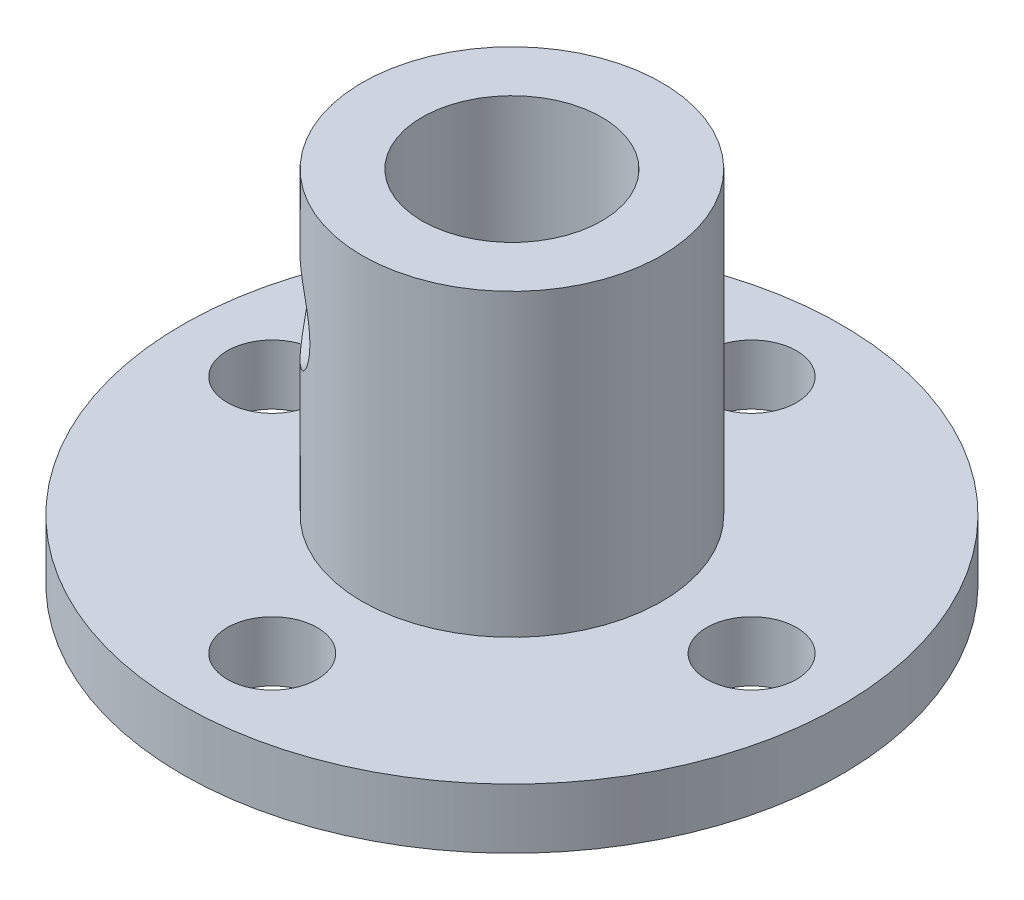
ISO-10303-21;
HEADER;
FILE_DESCRIPTION(('STEP AP214'),'2;1');
FILE_NAME('part.step','',(''),(''),'','','');
FILE_SCHEMA(('AUTOMOTIVE_DESIGN { 1 0 10303 214 1 1 1 1 }'));
ENDSEC;
DATA;
#1=APPLICATION_CONTEXT('core data for automotive mechanical design processes');
#2=APPLICATION_PROTOCOL_DEFINITION('international standard','automotive_design',2000,#1);
#3=PRODUCT_CONTEXT('',#1,'mechanical');
#4=PRODUCT('Part','Part','',(#3));
#5=PRODUCT_RELATED_PRODUCT_CATEGORY('part','',(#4));
#6=PRODUCT_DEFINITION_FORMATION('','',#4);
#7=PRODUCT_DEFINITION_CONTEXT('part definition',#1,'design');
#8=PRODUCT_DEFINITION('design','',#6,#7);
#9=PRODUCT_DEFINITION_SHAPE('','',#8);
#10=(LENGTH_UNIT() NAMED_UNIT(*) SI_UNIT(.MILLI.,.METRE.));
#11=(NAMED_UNIT(*) PLANE_ANGLE_UNIT() SI_UNIT($,.RADIAN.));
#12=(NAMED_UNIT(*) SI_UNIT($,.STERADIAN.) SOLID_ANGLE_UNIT());
#13=UNCERTAINTY_MEASURE_WITH_UNIT(LENGTH_MEASURE(1.E-05),#10,'distance_accuracy_value','');
#14=(GEOMETRIC_REPRESENTATION_CONTEXT(3) GLOBAL_UNCERTAINTY_ASSIGNED_CONTEXT((#13)) GLOBAL_UNIT_ASSIGNED_CONTEXT((#10,
#11,#12)) REPRESENTATION_CONTEXT('',''));
#15=CARTESIAN_POINT('',(0.,0.,0.));
#16=DIRECTION('',(0.,0.,1.));
#17=DIRECTION('',(1.,0.,0.));
#18=AXIS2_PLACEMENT_3D('',#15,#16,#17);
#19=CARTESIAN_POINT('',(0.,2.,0.));
#20=DIRECTION('',(0.,-1.,0.));
#21=DIRECTION('',(0.,0.,-1.));
#22=AXIS2_PLACEMENT_3D('',#19,#20,#21);
#23=CYLINDRICAL_SURFACE('',#22,11.);
#24=CARTESIAN_POINT('',(0.,2.,0.));
#25=DIRECTION('',(0.,1.,0.));
#26=DIRECTION('',(0.,0.,1.));
#27=AXIS2_PLACEMENT_3D('',#24,#25,#26);
#28=CIRCLE('',#27,11.);
#29=CARTESIAN_POINT('',(0.,2.,11.));
#30=VERTEX_POINT('',#29);
#31=EDGE_CURVE('E55',#30,#30,#28,.T.);
#32=ORIENTED_EDGE('',*,*,#31,.F.);
#33=EDGE_LOOP('',(#32));
#34=FACE_BOUND('',#33,.T.);
#35=CARTESIAN_POINT('',(0.,0.,0.));
#36=DIRECTION('',(0.,1.,0.));
#37=DIRECTION('',(0.,0.,1.));
#38=AXIS2_PLACEMENT_3D('',#35,#36,#37);
#39=CIRCLE('',#38,11.);
#40=CARTESIAN_POINT('',(0.,0.,11.));
#41=VERTEX_POINT('',#40);
#42=EDGE_CURVE('E60',#41,#41,#39,.T.);
#43=ORIENTED_EDGE('',*,*,#42,.T.);
#44=EDGE_LOOP('',(#43));
#45=FACE_BOUND('',#44,.T.);
#46=ADVANCED_FACE('F43',(#34,#45),#23,.T.);
#47=CARTESIAN_POINT('',(0.,2.,0.));
#48=DIRECTION('',(0.,1.,0.));
#49=DIRECTION('',(0.,0.,1.));
#50=AXIS2_PLACEMENT_3D('',#47,#48,#49);
#51=PLANE('',#50);
#52=CARTESIAN_POINT('',(0.,2.,8.));
#53=DIRECTION('',(0.,1.,0.));
#54=DIRECTION('',(0.,0.,1.));
#55=AXIS2_PLACEMENT_3D('',#52,#53,#54);
#56=CIRCLE('',#55,1.5);
#57=CARTESIAN_POINT('',(0.,2.,9.5));
#58=VERTEX_POINT('',#57);
#59=EDGE_CURVE('E77',#58,#58,#56,.T.);
#60=ORIENTED_EDGE('',*,*,#59,.F.);
#61=EDGE_LOOP('',(#60));
#62=FACE_BOUND('',#61,.T.);
#63=CARTESIAN_POINT('',(0.,2.,-8.));
#64=DIRECTION('',(0.,1.,0.));
#65=DIRECTION('',(0.,0.,1.));
#66=AXIS2_PLACEMENT_3D('',#63,#64,#65);
#67=CIRCLE('',#66,1.5);
#68=CARTESIAN_POINT('',(0.,2.,-6.5));
#69=VERTEX_POINT('',#68);
#70=EDGE_CURVE('E82',#69,#69,#67,.T.);
#71=ORIENTED_EDGE('',*,*,#70,.F.);
#72=EDGE_LOOP('',(#71));
#73=FACE_BOUND('',#72,.T.);
#74=CARTESIAN_POINT('',(8.,2.,0.));
#75=DIRECTION('',(0.,1.,0.));
#76=DIRECTION('',(0.,0.,1.));
#77=AXIS2_PLACEMENT_3D('',#74,#75,#76);
#78=CIRCLE('',#77,1.5);
#79=CARTESIAN_POINT('',(8.,2.,1.5));
#80=VERTEX_POINT('',#79);
#81=EDGE_CURVE('E85',#80,#80,#78,.T.);
#82=ORIENTED_EDGE('',*,*,#81,.F.);
#83=EDGE_LOOP('',(#82));
#84=FACE_BOUND('',#83,.T.);
#85=CARTESIAN_POINT('',(-8.,2.,0.));
#86=DIRECTION('',(0.,1.,0.));
#87=DIRECTION('',(0.,0.,1.));
#88=AXIS2_PLACEMENT_3D('',#85,#86,#87);
#89=CIRCLE('',#88,1.5);
#90=CARTESIAN_POINT('',(-8.,2.,1.5));
#91=VERTEX_POINT('',#90);
#92=EDGE_CURVE('E88',#91,#91,#89,.T.);
#93=ORIENTED_EDGE('',*,*,#92,.F.);
#94=EDGE_LOOP('',(#93));
#95=FACE_BOUND('',#94,.T.);
#96=CARTESIAN_POINT('',(0.,2.,0.));
#97=DIRECTION('',(0.,1.,0.));
#98=DIRECTION('',(0.,0.,1.));
#99=AXIS2_PLACEMENT_3D('',#96,#97,#98);
#100=CIRCLE('',#99,5.);
#101=CARTESIAN_POINT('',(0.,2.,5.));
#102=VERTEX_POINT('',#101);
#103=EDGE_CURVE('E10',#102,#102,#100,.T.);
#104=ORIENTED_EDGE('',*,*,#103,.F.);
#105=EDGE_LOOP('',(#104));
#106=FACE_BOUND('',#105,.T.);
#107=ORIENTED_EDGE('',*,*,#31,.T.);
#108=EDGE_LOOP('',(#107));
#109=FACE_BOUND('',#108,.T.);
#110=ADVANCED_FACE('F149',(#62,#73,#84,#95,#106,#109),#51,.T.);
#111=CARTESIAN_POINT('',(0.,0.,0.));
#112=DIRECTION('',(0.,1.,0.));
#113=DIRECTION('',(0.,0.,1.));
#114=AXIS2_PLACEMENT_3D('',#111,#112,#113);
#115=PLANE('',#114);
#116=CARTESIAN_POINT('',(0.,0.,8.));
#117=DIRECTION('',(0.,-1.,0.));
#118=DIRECTION('',(0.,0.,-1.));
#119=AXIS2_PLACEMENT_3D('',#116,#117,#118);
#120=CIRCLE('',#119,1.5);
#121=CARTESIAN_POINT('',(0.,0.,6.5));
#122=VERTEX_POINT('',#121);
#123=EDGE_CURVE('E91',#122,#122,#120,.T.);
#124=ORIENTED_EDGE('',*,*,#123,.F.);
#125=EDGE_LOOP('',(#124));
#126=FACE_BOUND('',#125,.T.);
#127=CARTESIAN_POINT('',(0.,0.,-8.));
#128=DIRECTION('',(0.,-1.,0.));
#129=DIRECTION('',(0.,0.,-1.));
#130=AXIS2_PLACEMENT_3D('',#127,#128,#129);
#131=CIRCLE('',#130,1.5);
#132=CARTESIAN_POINT('',(0.,0.,-9.5));
#133=VERTEX_POINT('',#132);
#134=EDGE_CURVE('E99',#133,#133,#131,.T.);
#135=ORIENTED_EDGE('',*,*,#134,.F.);
#136=EDGE_LOOP('',(#135));
#137=FACE_BOUND('',#136,.T.);
#138=CARTESIAN_POINT('',(8.,0.,0.));
#139=DIRECTION('',(0.,-1.,0.));
#140=DIRECTION('',(0.,0.,-1.));
#141=AXIS2_PLACEMENT_3D('',#138,#139,#140);
#142=CIRCLE('',#141,1.5);
#143=CARTESIAN_POINT('',(8.,0.,-1.5));
#144=VERTEX_POINT('',#143);
#145=EDGE_CURVE('E95',#144,#144,#142,.T.);
#146=ORIENTED_EDGE('',*,*,#145,.F.);
#147=EDGE_LOOP('',(#146));
#148=FACE_BOUND('',#147,.T.);
#149=CARTESIAN_POINT('',(-8.,0.,0.));
#150=DIRECTION('',(0.,-1.,0.));
#151=DIRECTION('',(0.,0.,-1.));
#152=AXIS2_PLACEMENT_3D('',#149,#150,#151);
#153=CIRCLE('',#152,1.5);
#154=CARTESIAN_POINT('',(-8.,0.,-1.5));
#155=VERTEX_POINT('',#154);
#156=EDGE_CURVE('E92',#155,#155,#153,.T.);
#157=ORIENTED_EDGE('',*,*,#156,.F.);
#158=EDGE_LOOP('',(#157));
#159=FACE_BOUND('',#158,.T.);
#160=CARTESIAN_POINT('',(0.,0.,0.));
#161=DIRECTION('',(0.,1.,0.));
#162=DIRECTION('',(0.,0.,1.));
#163=AXIS2_PLACEMENT_3D('',#160,#161,#162);
#164=CIRCLE('',#163,3.);
#165=CARTESIAN_POINT('',(0.,0.,3.));
#166=VERTEX_POINT('',#165);
#167=EDGE_CURVE('E69',#166,#166,#164,.T.);
#168=ORIENTED_EDGE('',*,*,#167,.T.);
#169=EDGE_LOOP('',(#168));
#170=FACE_BOUND('',#169,.T.);
#171=ORIENTED_EDGE('',*,*,#42,.F.);
#172=EDGE_LOOP('',(#171));
#173=FACE_BOUND('',#172,.T.);
#174=ADVANCED_FACE('F146',(#126,#137,#148,#159,#170,#173),#115,.F.);
#175=CARTESIAN_POINT('',(0.,12.,0.));
#176=DIRECTION('',(0.,-1.,0.));
#177=DIRECTION('',(0.,0.,-1.));
#178=AXIS2_PLACEMENT_3D('',#175,#176,#177);
#179=CYLINDRICAL_SURFACE('',#178,5.);
#180=CARTESIAN_POINT('',(-4.43334456258783,8.,2.31202421902819));
#181=CARTESIAN_POINT('',(-4.43334443992086,8.0821945479424,2.31202554403841));
#182=CARTESIAN_POINT('',(-4.43006993459257,8.16439922414403,2.31833642927143));
#183=CARTESIAN_POINT('',(-4.41695964010883,8.32640524959194,2.34321564064259));
#184=CARTESIAN_POINT('',(-4.40712165863545,8.40620578650146,2.36178806233067));
#185=CARTESIAN_POINT('',(-4.38087197181142,8.56103472827173,2.4101264355274));
#186=CARTESIAN_POINT('',(-4.36447119812474,8.63607082963309,2.43987376793349));
#187=CARTESIAN_POINT('',(-4.32504234678051,8.7796219339953,2.50910131305914));
#188=CARTESIAN_POINT('',(-4.3020132769563,8.84813595868444,2.54858298275095));
#189=CARTESIAN_POINT('',(-4.24852110256373,8.97886639057737,2.63681609316769));
#190=CARTESIAN_POINT('',(-4.21786377501926,9.04084589794629,2.68580086658526));
#191=CARTESIAN_POINT('',(-4.14950401628167,9.15463795132251,2.79025211380835));
#192=CARTESIAN_POINT('',(-4.11180068071223,9.20644919044988,2.84571941932361));
#193=CARTESIAN_POINT('',(-4.02870099338256,9.29946269983331,2.96222637051405));
#194=CARTESIAN_POINT('',(-3.98316167701534,9.34042342444281,3.02335752947632));
#195=CARTESIAN_POINT('',(-3.88552984554572,9.40898725904276,3.14784119759633));
#196=CARTESIAN_POINT('',(-3.83343874682247,9.43659324985745,3.21119322451312));
#197=CARTESIAN_POINT('',(-3.72532158709197,9.47688000109051,3.33595486065664));
#198=CARTESIAN_POINT('',(-3.66945071855995,9.4899651276527,3.39736819287556));
#199=CARTESIAN_POINT('',(-3.55395675199785,9.50211732464644,3.51800486407131));
#200=CARTESIAN_POINT('',(-3.49433444469874,9.50118733940196,3.57722866040972));
#201=CARTESIAN_POINT('',(-3.37510897121293,9.48560713145698,3.68987211946994));
#202=CARTESIAN_POINT('',(-3.31556566784942,9.47139480619013,3.74341656065754));
#203=CARTESIAN_POINT('',(-3.1965653052412,9.43036866400571,3.84553265451835));
#204=CARTESIAN_POINT('',(-3.1371082516974,9.40355404905733,3.89410399203613));
#205=CARTESIAN_POINT('',(-3.01956154086986,9.33778797658144,3.98596059760723));
#206=CARTESIAN_POINT('',(-2.96149587552015,9.29869879719273,4.02917770912896));
#207=CARTESIAN_POINT('',(-2.84945063455304,9.20960214757177,4.10918211710003));
#208=CARTESIAN_POINT('',(-2.79547203243598,9.15959208703652,4.14596788437747));
#209=CARTESIAN_POINT('',(-2.6915701592937,9.0478022492484,4.21419801434429));
#210=CARTESIAN_POINT('',(-2.64188342709997,8.98564308097026,4.24538181032646));
#211=CARTESIAN_POINT('',(-2.55107388266224,8.85248998210995,4.30056426843168));
#212=CARTESIAN_POINT('',(-2.50995192153674,8.78149517461077,4.32456221656942));
#213=CARTESIAN_POINT('',(-2.43784897157755,8.63176053075101,4.36561998102412));
#214=CARTESIAN_POINT('',(-2.40696900747494,8.55295295413708,4.38261105977234));
#215=CARTESIAN_POINT('',(-2.35758614215625,8.39039279155446,4.40937473672974));
#216=CARTESIAN_POINT('',(-2.33907920328655,8.30664182846544,4.41914968986497));
#217=CARTESIAN_POINT('',(-2.3159874008666,8.13991763926072,4.43129408808538));
#218=CARTESIAN_POINT('',(-2.31090933495099,8.05703177610602,4.43392597648717));
#219=CARTESIAN_POINT('',(-2.31354905591369,7.89152709999013,4.43254934299386));
#220=CARTESIAN_POINT('',(-2.32126505161215,7.80890825126915,4.42854175063195));
#221=CARTESIAN_POINT('',(-2.34866786614152,7.64851162202913,4.41406686187907));
#222=CARTESIAN_POINT('',(-2.36803849140189,7.57066383573648,4.40377008472265));
#223=CARTESIAN_POINT('',(-2.4174606479491,7.41959830918509,4.3768334249355));
#224=CARTESIAN_POINT('',(-2.44751382836051,7.34638128585943,4.36019256290484));
#225=CARTESIAN_POINT('',(-2.51782314425725,7.20448253592787,4.31998194950397));
#226=CARTESIAN_POINT('',(-2.55833147498567,7.13597527901421,4.29623821612196));
#227=CARTESIAN_POINT('',(-2.64735761279477,7.0073618938192,4.2419583803221));
#228=CARTESIAN_POINT('',(-2.69587733662623,6.94725778238721,4.21142065181082));
#229=CARTESIAN_POINT('',(-2.80097809014149,6.83481959418526,4.14229620181631));
#230=CARTESIAN_POINT('',(-2.85779424855097,6.78286437101302,4.10344920377485));
#231=CARTESIAN_POINT('',(-2.97577879668644,6.69103329897225,4.01870725418584));
#232=CARTESIAN_POINT('',(-3.03694697008581,6.65115685021854,3.97281265282398));
#233=CARTESIAN_POINT('',(-3.16085513459745,6.58499996943171,3.87494177347528));
#234=CARTESIAN_POINT('',(-3.22357954520105,6.55861798384103,3.82301464229711));
#235=CARTESIAN_POINT('',(-3.34875152909492,6.51993908110958,3.71385899712312));
#236=CARTESIAN_POINT('',(-3.4111991764942,6.50763813405158,3.65663200498942));
#237=CARTESIAN_POINT('',(-3.5313006605248,6.4977769559455,3.54070822676477));
#238=CARTESIAN_POINT('',(-3.58904649569495,6.49966730459217,3.48215291031684));
#239=CARTESIAN_POINT('',(-3.70063777145002,6.51682163249912,3.36332028629713));
#240=CARTESIAN_POINT('',(-3.7544834329982,6.53208485348044,3.30304307654896));
#241=CARTESIAN_POINT('',(-3.85645254842055,6.57521166139963,3.18337766679839));
#242=CARTESIAN_POINT('',(-3.90463124048534,6.60293818064901,3.1239868710096));
#243=CARTESIAN_POINT('',(-3.99512691609726,6.67008191450719,3.00739315885616));
#244=CARTESIAN_POINT('',(-4.03744293469284,6.70950105028619,2.95019060377826));
#245=CARTESIAN_POINT('',(-4.11701719288618,6.80037345743004,2.83814119214537));
#246=CARTESIAN_POINT('',(-4.15407027313071,6.85217143000077,2.78342827695238));
#247=CARTESIAN_POINT('',(-4.22126693047111,6.9657103883328,2.68042812035863));
#248=CARTESIAN_POINT('',(-4.25140851140172,7.02745423789815,2.63214273702943));
#249=CARTESIAN_POINT('',(-4.30555162407097,7.16134077831051,2.54264575594493));
#250=CARTESIAN_POINT('',(-4.32934338024624,7.23373855339044,2.50168788044894));
#251=CARTESIAN_POINT('',(-4.36961486920418,7.38555517416102,2.4306670726817));
#252=CARTESIAN_POINT('',(-4.38609811599728,7.4649706236012,2.40059890579738));
#253=CARTESIAN_POINT('',(-4.41043542393912,7.61974043160627,2.35555564624659));
#254=CARTESIAN_POINT('',(-4.41902857163294,7.69460864693099,2.33930224282498));
#255=CARTESIAN_POINT('',(-4.43048262371996,7.84631522249577,2.31753698650753));
#256=CARTESIAN_POINT('',(-4.43334467727385,7.92315318464525,2.31202298022563));
#257=CARTESIAN_POINT('',(-4.43334456258783,8.,2.31202421902819));
#258=B_SPLINE_CURVE_WITH_KNOTS('',3,(#180,#181,#182,#183,#184,#185,#186,#187,#188,#189,#190,
#191,#192,#193,#194,#195,#196,#197,#198,#199,#200,#201,#202,#203,#204,#205,#206,#207,#208,#209,
#210,#211,#212,#213,#214,#215,#216,#217,#218,#219,#220,#221,#222,#223,#224,#225,#226,#227,#228,
#229,#230,#231,#232,#233,#234,#235,#236,#237,#238,#239,#240,#241,#242,#243,#244,#245,#246,#247,
#248,#249,#250,#251,#252,#253,#254,#255,#256,#257),.UNSPECIFIED.,.T.,.F.,(4,2,2,2,2,2,2,2,2,2,2,
2,2,2,2,2,2,2,2,2,2,2,2,2,2,2,2,2,2,2,2,2,2,2,2,2,2,2,4),(0.,0.246300165915544,
0.492682641688999,0.738656414466193,0.9846670253701,1.23773150007984,1.49082847871272,
1.74915939273644,2.00743455587877,2.25832140149558,2.5091555410144,2.7520012599088,
2.99486235890376,3.24055209335676,3.4863001659083,3.74152147023278,3.99676812491863,
4.25446238246266,4.51207250628411,4.76008080790309,5.00805439107387,5.24958594938817,
5.49115481045787,5.73920731809388,5.98731925928923,6.24479506100602,6.50225807324202,
6.75775391814325,7.01317662321682,7.2587630391122,7.50433553047754,7.74727096872219,
7.99024634491378,8.24099627054488,8.4918185262989,8.75011639669147,9.00828993963944,
9.23861153857447,9.4688869503356),.UNSPECIFIED.);
#259=CARTESIAN_POINT('',(-4.43334456258783,8.,2.31202421902819));
#260=VERTEX_POINT('',#259);
#261=EDGE_CURVE('E96',#260,#260,#258,.T.);
#262=ORIENTED_EDGE('',*,*,#261,.T.);
#263=EDGE_LOOP('',(#262));
#264=FACE_BOUND('',#263,.T.);
#265=CARTESIAN_POINT('',(0.,12.,0.));
#266=DIRECTION('',(0.,1.,0.));
#267=DIRECTION('',(0.,0.,1.));
#268=AXIS2_PLACEMENT_3D('',#265,#266,#267);
#269=CIRCLE('',#268,5.);
#270=CARTESIAN_POINT('',(0.,12.,5.));
#271=VERTEX_POINT('',#270);
#272=EDGE_CURVE('E63',#271,#271,#269,.T.);
#273=ORIENTED_EDGE('',*,*,#272,.F.);
#274=EDGE_LOOP('',(#273));
#275=FACE_BOUND('',#274,.T.);
#276=ORIENTED_EDGE('',*,*,#103,.T.);
#277=EDGE_LOOP('',(#276));
#278=FACE_BOUND('',#277,.T.);
#279=ADVANCED_FACE('F109',(#264,#275,#278),#179,.T.);
#280=CARTESIAN_POINT('',(0.,12.,0.));
#281=DIRECTION('',(0.,1.,0.));
#282=DIRECTION('',(0.,0.,1.));
#283=AXIS2_PLACEMENT_3D('',#280,#281,#282);
#284=PLANE('',#283);
#285=CARTESIAN_POINT('',(0.,12.,0.));
#286=DIRECTION('',(0.,1.,0.));
#287=DIRECTION('',(0.,0.,1.));
#288=AXIS2_PLACEMENT_3D('',#285,#286,#287);
#289=CIRCLE('',#288,3.);
#290=CARTESIAN_POINT('',(0.,12.,3.));
#291=VERTEX_POINT('',#290);
#292=EDGE_CURVE('E73',#291,#291,#289,.T.);
#293=ORIENTED_EDGE('',*,*,#292,.F.);
#294=EDGE_LOOP('',(#293));
#295=FACE_BOUND('',#294,.T.);
#296=ORIENTED_EDGE('',*,*,#272,.T.);
#297=EDGE_LOOP('',(#296));
#298=FACE_BOUND('',#297,.T.);
#299=ADVANCED_FACE('F137',(#295,#298),#284,.T.);
#300=CARTESIAN_POINT('',(0.,-8.,0.));
#301=DIRECTION('',(0.,1.,0.));
#302=DIRECTION('',(0.,0.,1.));
#303=AXIS2_PLACEMENT_3D('',#300,#301,#302);
#304=CYLINDRICAL_SURFACE('',#303,3.);
#305=CARTESIAN_POINT('',(-2.8977774788672,8.,0.776457135307561));
#306=CARTESIAN_POINT('',(-2.89777843642086,7.92183828770712,0.776465807945202));
#307=CARTESIAN_POINT('',(-2.89596075365292,7.84357788271243,0.783337885586096));
#308=CARTESIAN_POINT('',(-2.88854556363685,7.68945910298427,0.810238787422553));
#309=CARTESIAN_POINT('',(-2.88294011324794,7.61360612743489,0.830295257550602));
#310=CARTESIAN_POINT('',(-2.86759385571555,7.46682250348409,0.881825990933507));
#311=CARTESIAN_POINT('',(-2.85787499736417,7.39586802128962,0.913239525995623));
#312=CARTESIAN_POINT('',(-2.83375960105533,7.25986369700492,0.98552207479157));
#313=CARTESIAN_POINT('',(-2.81936281002992,7.19481417460632,1.02639160004348));
#314=CARTESIAN_POINT('',(-2.78384605508351,7.06654140716374,1.11931695974479));
#315=CARTESIAN_POINT('',(-2.7622695134035,7.00391129648968,1.17201739854081));
#316=CARTESIAN_POINT('',(-2.7120800954357,6.88788741738994,1.28389309696414));
#317=CARTESIAN_POINT('',(-2.68346372649268,6.83449825612472,1.34307156240821));
#318=CARTESIAN_POINT('',(-2.61633504151045,6.73494927327851,1.4697835351575));
#319=CARTESIAN_POINT('',(-2.57728569203883,6.68951934821071,1.53761134146163));
#320=CARTESIAN_POINT('',(-2.4900743247597,6.61228872013136,1.67515420911279));
#321=CARTESIAN_POINT('',(-2.44191808567332,6.58047941579425,1.74486804977895));
#322=CARTESIAN_POINT('',(-2.34071742954988,6.53374300804835,1.87817425418938));
#323=CARTESIAN_POINT('',(-2.28826464060798,6.5177757104667,1.94184923030434));
#324=CARTESIAN_POINT('',(-2.1771603544596,6.49975082198744,2.06564121032913));
#325=CARTESIAN_POINT('',(-2.11851262971613,6.49768481480644,2.12576034519837));
#326=CARTESIAN_POINT('',(-2.00231140292521,6.50712001095552,2.23530137136982));
#327=CARTESIAN_POINT('',(-1.94510625043172,6.51745702328183,2.28519887174933));
#328=CARTESIAN_POINT('',(-1.8290328206712,6.54932126585699,2.37912040040672));
#329=CARTESIAN_POINT('',(-1.77016441926511,6.57084933346434,2.42314398886576));
#330=CARTESIAN_POINT('',(-1.65187898356767,6.62462384913472,2.50530608030927));
#331=CARTESIAN_POINT('',(-1.59246562724667,6.6570144697581,2.54335473361967));
#332=CARTESIAN_POINT('',(-1.47580220064365,6.73139512430224,2.61278069336991));
#333=CARTESIAN_POINT('',(-1.41855291342132,6.77338859495352,2.64415560358889));
#334=CARTESIAN_POINT('',(-1.30277736945863,6.87034302729952,2.70321718660422));
#335=CARTESIAN_POINT('',(-1.2446419510183,6.92615454248901,2.7302748716661));
#336=CARTESIAN_POINT('',(-1.13537205134786,7.04688458739526,2.77749540009897));
#337=CARTESIAN_POINT('',(-1.08424296543308,7.11181005841109,2.79765294762602));
#338=CARTESIAN_POINT('',(-0.988467637856777,7.25397228863613,2.83296699306694));
#339=CARTESIAN_POINT('',(-0.944439272066018,7.33172903458132,2.84772461492292));
#340=CARTESIAN_POINT('',(-0.870203141463102,7.4944065070385,2.87128516634125));
#341=CARTESIAN_POINT('',(-0.83998095830825,7.57931964952634,2.88009431275189));
#342=CARTESIAN_POINT('',(-0.797898740855281,7.74682176692419,2.8920242052622));
#343=CARTESIAN_POINT('',(-0.784773377993305,7.82906167856533,2.89554041189933));
#344=CARTESIAN_POINT('',(-0.773923684249221,7.99460201227481,2.89846195751578));
#345=CARTESIAN_POINT('',(-0.776188474338463,8.07790164367968,2.89787020033614));
#346=CARTESIAN_POINT('',(-0.794760432934035,8.23348087786809,2.89282271219333));
#347=CARTESIAN_POINT('',(-0.809504390277576,8.30596917666189,2.88879674637904));
#348=CARTESIAN_POINT('',(-0.849847525365748,8.44755167940644,2.87718549622091));
#349=CARTESIAN_POINT('',(-0.875450218468106,8.51664477611991,2.86959905914146));
#350=CARTESIAN_POINT('',(-0.937320913584768,8.65311699635404,2.85000428601381));
#351=CARTESIAN_POINT('',(-0.974027961374802,8.72026852528033,2.83780742241691));
#352=CARTESIAN_POINT('',(-1.05564763070854,8.84820390730849,2.80846718922543));
#353=CARTESIAN_POINT('',(-1.10056446582024,8.90898446526992,2.79132127696574));
#354=CARTESIAN_POINT('',(-1.20283404947151,9.03046815128532,2.74893115939282));
#355=CARTESIAN_POINT('',(-1.26104068458325,9.09019572607649,2.72293857041294));
#356=CARTESIAN_POINT('',(-1.38303494861758,9.19911835699039,2.66304918010131));
#357=CARTESIAN_POINT('',(-1.44682445252411,9.24830985534581,2.62914971686415));
#358=CARTESIAN_POINT('',(-1.57919386501897,9.33586058892515,2.55189425785636));
#359=CARTESIAN_POINT('',(-1.647855769965,9.37389967731637,2.50831229866665));
#360=CARTESIAN_POINT('',(-1.78542113059001,9.43570685578609,2.41231873467998));
#361=CARTESIAN_POINT('',(-1.85432432047734,9.45948747704946,2.35991493507781));
#362=CARTESIAN_POINT('',(-1.98311144359732,9.49005284626199,2.25247602694357));
#363=CARTESIAN_POINT('',(-2.04324285223115,9.49819681381417,2.19812351338379));
#364=CARTESIAN_POINT('',(-2.15902393796182,9.5012648981816,2.08451046937594));
#365=CARTESIAN_POINT('',(-2.21467517691624,9.49619364278535,2.02525166408007));
#366=CARTESIAN_POINT('',(-2.31635207595353,9.47387538980657,1.90791731594304));
#367=CARTESIAN_POINT('',(-2.36277036625901,9.45745272611349,1.85002110919703));
#368=CARTESIAN_POINT('',(-2.44945348099617,9.41400950104554,1.73362251777721));
#369=CARTESIAN_POINT('',(-2.48971742182762,9.38698741985982,1.67512004734522));
#370=CARTESIAN_POINT('',(-2.56540042262159,9.32190942175104,1.5568750791499));
#371=CARTESIAN_POINT('',(-2.60053861020872,9.28343101518824,1.49718656380225));
#372=CARTESIAN_POINT('',(-2.66401345602037,9.19706310371143,1.38109270507128));
#373=CARTESIAN_POINT('',(-2.69234697700719,9.14916927632649,1.32468888511395));
#374=CARTESIAN_POINT('',(-2.74520076947935,9.03980429146594,1.21166858581718));
#375=CARTESIAN_POINT('',(-2.76906092274573,8.97745626878421,1.15558958126822));
#376=CARTESIAN_POINT('',(-2.8100006811322,8.84382391830534,1.05214039162087));
#377=CARTESIAN_POINT('',(-2.82707429614389,8.77253176869847,1.00477791984151));
#378=CARTESIAN_POINT('',(-2.85575022521723,8.62004503012857,0.920191613571826));
#379=CARTESIAN_POINT('',(-2.86716258468163,8.5386087033069,0.883335479265526));
#380=CARTESIAN_POINT('',(-2.88450805289951,8.37000139349033,0.824963295294625));
#381=CARTESIAN_POINT('',(-2.89045950183027,8.28285066663097,0.803395954954623));
#382=CARTESIAN_POINT('',(-2.89524136224008,8.16229196652201,0.78587039949277));
#383=CARTESIAN_POINT('',(-2.89619347565166,8.12994815840318,0.782348442320772));
#384=CARTESIAN_POINT('',(-2.89746135588973,8.06507527897664,0.777639926487407));
#385=CARTESIAN_POINT('',(-2.89777708014604,8.03254619542119,0.776453524059148));
#386=CARTESIAN_POINT('',(-2.8977774788672,8.,0.776457135307561));
#387=B_SPLINE_CURVE_WITH_KNOTS('',3,(#305,#306,#307,#308,#309,#310,#311,#312,#313,#314,#315,
#316,#317,#318,#319,#320,#321,#322,#323,#324,#325,#326,#327,#328,#329,#330,#331,#332,#333,#334,
#335,#336,#337,#338,#339,#340,#341,#342,#343,#344,#345,#346,#347,#348,#349,#350,#351,#352,#353,
#354,#355,#356,#357,#358,#359,#360,#361,#362,#363,#364,#365,#366,#367,#368,#369,#370,#371,#372,
#373,#374,#375,#376,#377,#378,#379,#380,#381,#382,#383,#384,#385,#386),.UNSPECIFIED.,.T.,.F.,(4,
2,2,2,2,2,2,2,2,2,2,2,2,2,2,2,2,2,2,2,2,2,2,2,2,2,2,2,2,2,2,2,2,2,2,2,2,2,2,2,4),(0.,
0.234348183892073,0.469189339237207,0.702792893878328,0.936409088167723,1.18929346874735,
1.44230356626556,1.71236838358145,1.98226240445836,2.23295227451903,2.4834903552906,
2.71224146226807,2.94100968776183,3.1729430209672,3.40495949025408,3.65890787185336,
3.91305072368878,4.18333262594172,4.45333161317557,4.70193436281317,4.95036139782559,
5.17161275136038,5.39293578654094,5.62450944609131,5.85620229330071,6.1171011537092,
6.37808797467303,6.64596272119449,6.91360169713157,7.1566840558423,7.39968130190957,
7.62666637307239,7.85368400268019,8.09041126079208,8.32724745151078,8.58765362775101,
8.84828914267731,9.11716123557907,9.3851269950414,9.48270202777964,9.5802835874181),.UNSPECIFIED.);
#388=CARTESIAN_POINT('',(-2.8977774788672,8.,0.776457135307561));
#389=VERTEX_POINT('',#388);
#390=EDGE_CURVE('E46',#389,#389,#387,.T.);
#391=ORIENTED_EDGE('',*,*,#390,.T.);
#392=EDGE_LOOP('',(#391));
#393=FACE_BOUND('',#392,.T.);
#394=ORIENTED_EDGE('',*,*,#292,.T.);
#395=EDGE_LOOP('',(#394));
#396=FACE_BOUND('',#395,.T.);
#397=ORIENTED_EDGE('',*,*,#167,.F.);
#398=EDGE_LOOP('',(#397));
#399=FACE_BOUND('',#398,.T.);
#400=ADVANCED_FACE('F133',(#393,#396,#399),#304,.F.);
#401=CARTESIAN_POINT('',(-8.,20.,0.));
#402=DIRECTION('',(0.,-1.,0.));
#403=DIRECTION('',(0.,0.,-1.));
#404=AXIS2_PLACEMENT_3D('',#401,#402,#403);
#405=CYLINDRICAL_SURFACE('',#404,1.5);
#406=ORIENTED_EDGE('',*,*,#92,.T.);
#407=EDGE_LOOP('',(#406));
#408=FACE_BOUND('',#407,.T.);
#409=ORIENTED_EDGE('',*,*,#156,.T.);
#410=EDGE_LOOP('',(#409));
#411=FACE_BOUND('',#410,.T.);
#412=ADVANCED_FACE('F130',(#408,#411),#405,.F.);
#413=CARTESIAN_POINT('',(8.,20.,0.));
#414=DIRECTION('',(0.,-1.,0.));
#415=DIRECTION('',(0.,0.,-1.));
#416=AXIS2_PLACEMENT_3D('',#413,#414,#415);
#417=CYLINDRICAL_SURFACE('',#416,1.5);
#418=ORIENTED_EDGE('',*,*,#81,.T.);
#419=EDGE_LOOP('',(#418));
#420=FACE_BOUND('',#419,.T.);
#421=ORIENTED_EDGE('',*,*,#145,.T.);
#422=EDGE_LOOP('',(#421));
#423=FACE_BOUND('',#422,.T.);
#424=ADVANCED_FACE('F126',(#420,#423),#417,.F.);
#425=CARTESIAN_POINT('',(0.,20.,-8.));
#426=DIRECTION('',(0.,-1.,0.));
#427=DIRECTION('',(0.,0.,-1.));
#428=AXIS2_PLACEMENT_3D('',#425,#426,#427);
#429=CYLINDRICAL_SURFACE('',#428,1.5);
#430=ORIENTED_EDGE('',*,*,#70,.T.);
#431=EDGE_LOOP('',(#430));
#432=FACE_BOUND('',#431,.T.);
#433=ORIENTED_EDGE('',*,*,#134,.T.);
#434=EDGE_LOOP('',(#433));
#435=FACE_BOUND('',#434,.T.);
#436=ADVANCED_FACE('F122',(#432,#435),#429,.F.);
#437=CARTESIAN_POINT('',(0.,20.,8.));
#438=DIRECTION('',(0.,-1.,0.));
#439=DIRECTION('',(0.,0.,-1.));
#440=AXIS2_PLACEMENT_3D('',#437,#438,#439);
#441=CYLINDRICAL_SURFACE('',#440,1.5);
#442=ORIENTED_EDGE('',*,*,#59,.T.);
#443=EDGE_LOOP('',(#442));
#444=FACE_BOUND('',#443,.T.);
#445=ORIENTED_EDGE('',*,*,#123,.T.);
#446=EDGE_LOOP('',(#445));
#447=FACE_BOUND('',#446,.T.);
#448=ADVANCED_FACE('F117',(#444,#447),#441,.F.);
#449=CARTESIAN_POINT('',(-11.,8.,11.));
#450=DIRECTION('',(0.707106781186547,0.,-0.707106781186548));
#451=DIRECTION('',(-0.707106781186548,0.,-0.707106781186547));
#452=AXIS2_PLACEMENT_3D('',#449,#450,#451);
#453=CYLINDRICAL_SURFACE('',#452,1.5);
#454=ORIENTED_EDGE('',*,*,#390,.F.);
#455=EDGE_LOOP('',(#454));
#456=FACE_BOUND('',#455,.T.);
#457=ORIENTED_EDGE('',*,*,#261,.F.);
#458=EDGE_LOOP('',(#457));
#459=FACE_BOUND('',#458,.T.);
#460=ADVANCED_FACE('F113',(#456,#459),#453,.F.);
#461=CLOSED_SHELL('',(#46,#110,#174,#279,#299,#400,#412,#424,#436,#448,#460));
#462=MANIFOLD_SOLID_BREP('B2',#461);
#463=ADVANCED_BREP_SHAPE_REPRESENTATION('',(#18,#462),#14);
#464=SHAPE_DEFINITION_REPRESENTATION(#9,#463);
ENDSEC;
END-ISO-10303-21;
